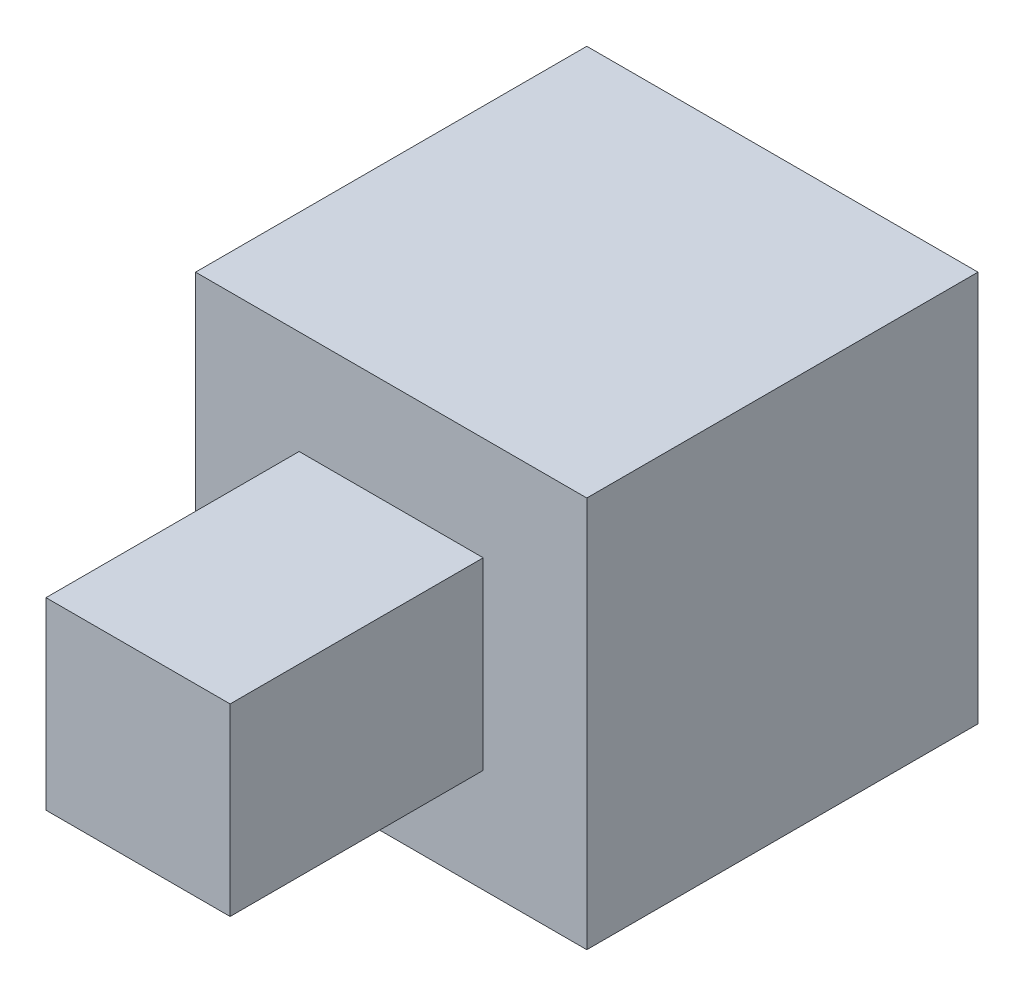
ISO-10303-21;
HEADER;
FILE_DESCRIPTION(('STEP AP214'),'2;1');
FILE_NAME('part.step','',(''),(''),'','','');
FILE_SCHEMA(('AUTOMOTIVE_DESIGN { 1 0 10303 214 1 1 1 1 }'));
ENDSEC;
DATA;
#1=APPLICATION_CONTEXT('core data for automotive mechanical design processes');
#2=APPLICATION_PROTOCOL_DEFINITION('international standard','automotive_design',2000,#1);
#3=PRODUCT_CONTEXT('',#1,'mechanical');
#4=PRODUCT('Part','Part','',(#3));
#5=PRODUCT_RELATED_PRODUCT_CATEGORY('part','',(#4));
#6=PRODUCT_DEFINITION_FORMATION('','',#4);
#7=PRODUCT_DEFINITION_CONTEXT('part definition',#1,'design');
#8=PRODUCT_DEFINITION('design','',#6,#7);
#9=PRODUCT_DEFINITION_SHAPE('','',#8);
#10=(LENGTH_UNIT() NAMED_UNIT(*) SI_UNIT(.MILLI.,.METRE.));
#11=(NAMED_UNIT(*) PLANE_ANGLE_UNIT() SI_UNIT($,.RADIAN.));
#12=(NAMED_UNIT(*) SI_UNIT($,.STERADIAN.) SOLID_ANGLE_UNIT());
#13=UNCERTAINTY_MEASURE_WITH_UNIT(LENGTH_MEASURE(1.E-05),#10,'distance_accuracy_value','');
#14=(GEOMETRIC_REPRESENTATION_CONTEXT(3) GLOBAL_UNCERTAINTY_ASSIGNED_CONTEXT((#13)) GLOBAL_UNIT_ASSIGNED_CONTEXT((#10,
#11,#12)) REPRESENTATION_CONTEXT('',''));
#15=CARTESIAN_POINT('',(0.,0.,0.));
#16=DIRECTION('',(0.,0.,1.));
#17=DIRECTION('',(1.,0.,0.));
#18=AXIS2_PLACEMENT_3D('',#15,#16,#17);
#19=CARTESIAN_POINT('',(4.25,4.25,8.5));
#20=DIRECTION('',(-1.,0.,0.));
#21=DIRECTION('',(0.,-1.,0.));
#22=AXIS2_PLACEMENT_3D('',#19,#20,#21);
#23=PLANE('',#22);
#24=DIRECTION('',(0.,1.,0.));
#25=VECTOR('',#24,1.);
#26=CARTESIAN_POINT('',(4.25,4.25,0.));
#27=LINE('',#26,#25);
#28=CARTESIAN_POINT('',(4.25,-4.25,0.));
#29=VERTEX_POINT('',#28);
#30=CARTESIAN_POINT('',(4.25,4.25,0.));
#31=VERTEX_POINT('',#30);
#32=EDGE_CURVE('E127',#29,#31,#27,.T.);
#33=ORIENTED_EDGE('',*,*,#32,.T.);
#34=DIRECTION('',(0.,0.,-1.));
#35=VECTOR('',#34,1.);
#36=CARTESIAN_POINT('',(4.25,4.25,8.5));
#37=LINE('',#36,#35);
#38=CARTESIAN_POINT('',(4.25,4.25,8.5));
#39=VERTEX_POINT('',#38);
#40=EDGE_CURVE('E11',#39,#31,#37,.T.);
#41=ORIENTED_EDGE('',*,*,#40,.F.);
#42=DIRECTION('',(0.,1.,0.));
#43=VECTOR('',#42,1.);
#44=CARTESIAN_POINT('',(4.25,4.25,8.5));
#45=LINE('',#44,#43);
#46=CARTESIAN_POINT('',(4.25,-4.25,8.5));
#47=VERTEX_POINT('',#46);
#48=EDGE_CURVE('E138',#47,#39,#45,.T.);
#49=ORIENTED_EDGE('',*,*,#48,.F.);
#50=DIRECTION('',(0.,0.,-1.));
#51=VECTOR('',#50,1.);
#52=CARTESIAN_POINT('',(4.25,-4.25,8.5));
#53=LINE('',#52,#51);
#54=EDGE_CURVE('E151',#47,#29,#53,.T.);
#55=ORIENTED_EDGE('',*,*,#54,.T.);
#56=EDGE_LOOP('',(#33,#41,#49,#55));
#57=FACE_BOUND('',#56,.T.);
#58=ADVANCED_FACE('F39',(#57),#23,.F.);
#59=CARTESIAN_POINT('',(-4.25,4.25,8.5));
#60=DIRECTION('',(0.,-1.,0.));
#61=DIRECTION('',(1.,0.,0.));
#62=AXIS2_PLACEMENT_3D('',#59,#60,#61);
#63=PLANE('',#62);
#64=DIRECTION('',(-1.,0.,0.));
#65=VECTOR('',#64,1.);
#66=CARTESIAN_POINT('',(-4.25,4.25,0.));
#67=LINE('',#66,#65);
#68=CARTESIAN_POINT('',(-4.25,4.25,0.));
#69=VERTEX_POINT('',#68);
#70=EDGE_CURVE('E132',#31,#69,#67,.T.);
#71=ORIENTED_EDGE('',*,*,#70,.T.);
#72=DIRECTION('',(0.,0.,-1.));
#73=VECTOR('',#72,1.);
#74=CARTESIAN_POINT('',(-4.25,4.25,8.5));
#75=LINE('',#74,#73);
#76=CARTESIAN_POINT('',(-4.25,4.25,8.5));
#77=VERTEX_POINT('',#76);
#78=EDGE_CURVE('E47',#77,#69,#75,.T.);
#79=ORIENTED_EDGE('',*,*,#78,.F.);
#80=DIRECTION('',(-1.,0.,0.));
#81=VECTOR('',#80,1.);
#82=CARTESIAN_POINT('',(-4.25,4.25,8.5));
#83=LINE('',#82,#81);
#84=EDGE_CURVE('E142',#39,#77,#83,.T.);
#85=ORIENTED_EDGE('',*,*,#84,.F.);
#86=ORIENTED_EDGE('',*,*,#40,.T.);
#87=EDGE_LOOP('',(#71,#79,#85,#86));
#88=FACE_BOUND('',#87,.T.);
#89=ADVANCED_FACE('F188',(#88),#63,.F.);
#90=CARTESIAN_POINT('',(-4.25,4.25,8.5));
#91=DIRECTION('',(1.,0.,0.));
#92=DIRECTION('',(0.,1.,0.));
#93=AXIS2_PLACEMENT_3D('',#90,#91,#92);
#94=PLANE('',#93);
#95=DIRECTION('',(0.,-1.,0.));
#96=VECTOR('',#95,1.);
#97=CARTESIAN_POINT('',(-4.25,4.25,0.));
#98=LINE('',#97,#96);
#99=CARTESIAN_POINT('',(-4.25,-4.25,0.));
#100=VERTEX_POINT('',#99);
#101=EDGE_CURVE('E155',#69,#100,#98,.T.);
#102=ORIENTED_EDGE('',*,*,#101,.T.);
#103=DIRECTION('',(0.,0.,-1.));
#104=VECTOR('',#103,1.);
#105=CARTESIAN_POINT('',(-4.25,-4.25,8.5));
#106=LINE('',#105,#104);
#107=CARTESIAN_POINT('',(-4.25,-4.25,8.5));
#108=VERTEX_POINT('',#107);
#109=EDGE_CURVE('E163',#108,#100,#106,.T.);
#110=ORIENTED_EDGE('',*,*,#109,.F.);
#111=DIRECTION('',(0.,-1.,0.));
#112=VECTOR('',#111,1.);
#113=CARTESIAN_POINT('',(-4.25,4.25,8.5));
#114=LINE('',#113,#112);
#115=EDGE_CURVE('E146',#77,#108,#114,.T.);
#116=ORIENTED_EDGE('',*,*,#115,.F.);
#117=ORIENTED_EDGE('',*,*,#78,.T.);
#118=EDGE_LOOP('',(#102,#110,#116,#117));
#119=FACE_BOUND('',#118,.T.);
#120=ADVANCED_FACE('F172',(#119),#94,.F.);
#121=CARTESIAN_POINT('',(-4.25,-4.25,8.5));
#122=DIRECTION('',(0.,1.,0.));
#123=DIRECTION('',(0.,0.,1.));
#124=AXIS2_PLACEMENT_3D('',#121,#122,#123);
#125=PLANE('',#124);
#126=DIRECTION('',(1.,0.,0.));
#127=VECTOR('',#126,1.);
#128=CARTESIAN_POINT('',(-4.25,-4.25,0.));
#129=LINE('',#128,#127);
#130=EDGE_CURVE('E143',#100,#29,#129,.T.);
#131=ORIENTED_EDGE('',*,*,#130,.T.);
#132=ORIENTED_EDGE('',*,*,#54,.F.);
#133=DIRECTION('',(1.,0.,0.));
#134=VECTOR('',#133,1.);
#135=CARTESIAN_POINT('',(-4.25,-4.25,8.5));
#136=LINE('',#135,#134);
#137=EDGE_CURVE('E149',#108,#47,#136,.T.);
#138=ORIENTED_EDGE('',*,*,#137,.F.);
#139=ORIENTED_EDGE('',*,*,#109,.T.);
#140=EDGE_LOOP('',(#131,#132,#138,#139));
#141=FACE_BOUND('',#140,.T.);
#142=ADVANCED_FACE('F181',(#141),#125,.F.);
#143=CARTESIAN_POINT('',(0.,0.,8.5));
#144=DIRECTION('',(0.,0.,1.));
#145=DIRECTION('',(1.,0.,0.));
#146=AXIS2_PLACEMENT_3D('',#143,#144,#145);
#147=PLANE('',#146);
#148=DIRECTION('',(0.,1.,0.));
#149=VECTOR('',#148,1.);
#150=CARTESIAN_POINT('',(2.,2.,8.5));
#151=LINE('',#150,#149);
#152=CARTESIAN_POINT('',(2.,-2.,8.5));
#153=VERTEX_POINT('',#152);
#154=CARTESIAN_POINT('',(2.,2.,8.5));
#155=VERTEX_POINT('',#154);
#156=EDGE_CURVE('E54',#153,#155,#151,.T.);
#157=ORIENTED_EDGE('',*,*,#156,.F.);
#158=DIRECTION('',(1.,0.,0.));
#159=VECTOR('',#158,1.);
#160=CARTESIAN_POINT('',(-2.,-2.,8.5));
#161=LINE('',#160,#159);
#162=CARTESIAN_POINT('',(-2.,-2.,8.5));
#163=VERTEX_POINT('',#162);
#164=EDGE_CURVE('E58',#163,#153,#161,.T.);
#165=ORIENTED_EDGE('',*,*,#164,.F.);
#166=DIRECTION('',(0.,-1.,0.));
#167=VECTOR('',#166,1.);
#168=CARTESIAN_POINT('',(-2.,2.,8.5));
#169=LINE('',#168,#167);
#170=CARTESIAN_POINT('',(-2.,2.,8.5));
#171=VERTEX_POINT('',#170);
#172=EDGE_CURVE('E283',#171,#163,#169,.T.);
#173=ORIENTED_EDGE('',*,*,#172,.F.);
#174=DIRECTION('',(-1.,0.,0.));
#175=VECTOR('',#174,1.);
#176=CARTESIAN_POINT('',(-2.,2.,8.5));
#177=LINE('',#176,#175);
#178=EDGE_CURVE('E293',#155,#171,#177,.T.);
#179=ORIENTED_EDGE('',*,*,#178,.F.);
#180=EDGE_LOOP('',(#157,#165,#173,#179));
#181=FACE_BOUND('',#180,.T.);
#182=ORIENTED_EDGE('',*,*,#48,.T.);
#183=ORIENTED_EDGE('',*,*,#84,.T.);
#184=ORIENTED_EDGE('',*,*,#115,.T.);
#185=ORIENTED_EDGE('',*,*,#137,.T.);
#186=EDGE_LOOP('',(#182,#183,#184,#185));
#187=FACE_BOUND('',#186,.T.);
#188=ADVANCED_FACE('F187',(#181,#187),#147,.T.);
#189=CARTESIAN_POINT('',(0.,0.,0.));
#190=DIRECTION('',(0.,0.,1.));
#191=DIRECTION('',(1.,0.,0.));
#192=AXIS2_PLACEMENT_3D('',#189,#190,#191);
#193=PLANE('',#192);
#194=ORIENTED_EDGE('',*,*,#32,.F.);
#195=ORIENTED_EDGE('',*,*,#130,.F.);
#196=ORIENTED_EDGE('',*,*,#101,.F.);
#197=ORIENTED_EDGE('',*,*,#70,.F.);
#198=EDGE_LOOP('',(#194,#195,#196,#197));
#199=FACE_BOUND('',#198,.T.);
#200=ADVANCED_FACE('F178',(#199),#193,.F.);
#201=CARTESIAN_POINT('',(2.,2.,14.));
#202=DIRECTION('',(-1.,0.,0.));
#203=DIRECTION('',(0.,-1.,0.));
#204=AXIS2_PLACEMENT_3D('',#201,#202,#203);
#205=PLANE('',#204);
#206=ORIENTED_EDGE('',*,*,#156,.T.);
#207=DIRECTION('',(0.,0.,-1.));
#208=VECTOR('',#207,1.);
#209=CARTESIAN_POINT('',(2.,2.,14.));
#210=LINE('',#209,#208);
#211=CARTESIAN_POINT('',(2.,2.,14.));
#212=VERTEX_POINT('',#211);
#213=EDGE_CURVE('E107',#212,#155,#210,.T.);
#214=ORIENTED_EDGE('',*,*,#213,.F.);
#215=DIRECTION('',(0.,1.,0.));
#216=VECTOR('',#215,1.);
#217=CARTESIAN_POINT('',(2.,2.,14.));
#218=LINE('',#217,#216);
#219=CARTESIAN_POINT('',(2.,-2.,14.));
#220=VERTEX_POINT('',#219);
#221=EDGE_CURVE('E114',#220,#212,#218,.T.);
#222=ORIENTED_EDGE('',*,*,#221,.F.);
#223=DIRECTION('',(0.,0.,-1.));
#224=VECTOR('',#223,1.);
#225=CARTESIAN_POINT('',(2.,-2.,14.));
#226=LINE('',#225,#224);
#227=EDGE_CURVE('E280',#220,#153,#226,.T.);
#228=ORIENTED_EDGE('',*,*,#227,.T.);
#229=EDGE_LOOP('',(#206,#214,#222,#228));
#230=FACE_BOUND('',#229,.T.);
#231=ADVANCED_FACE('F125',(#230),#205,.F.);
#232=CARTESIAN_POINT('',(-2.,2.,14.));
#233=DIRECTION('',(0.,-1.,0.));
#234=DIRECTION('',(0.,0.,-1.));
#235=AXIS2_PLACEMENT_3D('',#232,#233,#234);
#236=PLANE('',#235);
#237=ORIENTED_EDGE('',*,*,#178,.T.);
#238=DIRECTION('',(0.,0.,-1.));
#239=VECTOR('',#238,1.);
#240=CARTESIAN_POINT('',(-2.,2.,14.));
#241=LINE('',#240,#239);
#242=CARTESIAN_POINT('',(-2.,2.,14.));
#243=VERTEX_POINT('',#242);
#244=EDGE_CURVE('E109',#243,#171,#241,.T.);
#245=ORIENTED_EDGE('',*,*,#244,.F.);
#246=DIRECTION('',(-1.,0.,0.));
#247=VECTOR('',#246,1.);
#248=CARTESIAN_POINT('',(-2.,2.,14.));
#249=LINE('',#248,#247);
#250=EDGE_CURVE('E102',#212,#243,#249,.T.);
#251=ORIENTED_EDGE('',*,*,#250,.F.);
#252=ORIENTED_EDGE('',*,*,#213,.T.);
#253=EDGE_LOOP('',(#237,#245,#251,#252));
#254=FACE_BOUND('',#253,.T.);
#255=ADVANCED_FACE('F105',(#254),#236,.F.);
#256=CARTESIAN_POINT('',(-2.,2.,14.));
#257=DIRECTION('',(1.,0.,0.));
#258=DIRECTION('',(0.,1.,0.));
#259=AXIS2_PLACEMENT_3D('',#256,#257,#258);
#260=PLANE('',#259);
#261=ORIENTED_EDGE('',*,*,#172,.T.);
#262=DIRECTION('',(0.,0.,-1.));
#263=VECTOR('',#262,1.);
#264=CARTESIAN_POINT('',(-2.,-2.,14.));
#265=LINE('',#264,#263);
#266=CARTESIAN_POINT('',(-2.,-2.,14.));
#267=VERTEX_POINT('',#266);
#268=EDGE_CURVE('E134',#267,#163,#265,.T.);
#269=ORIENTED_EDGE('',*,*,#268,.F.);
#270=DIRECTION('',(0.,-1.,0.));
#271=VECTOR('',#270,1.);
#272=CARTESIAN_POINT('',(-2.,2.,14.));
#273=LINE('',#272,#271);
#274=EDGE_CURVE('E113',#243,#267,#273,.T.);
#275=ORIENTED_EDGE('',*,*,#274,.F.);
#276=ORIENTED_EDGE('',*,*,#244,.T.);
#277=EDGE_LOOP('',(#261,#269,#275,#276));
#278=FACE_BOUND('',#277,.T.);
#279=ADVANCED_FACE('F206',(#278),#260,.F.);
#280=CARTESIAN_POINT('',(-2.,-2.,14.));
#281=DIRECTION('',(0.,1.,0.));
#282=DIRECTION('',(0.,0.,1.));
#283=AXIS2_PLACEMENT_3D('',#280,#281,#282);
#284=PLANE('',#283);
#285=ORIENTED_EDGE('',*,*,#164,.T.);
#286=ORIENTED_EDGE('',*,*,#227,.F.);
#287=DIRECTION('',(1.,0.,0.));
#288=VECTOR('',#287,1.);
#289=CARTESIAN_POINT('',(-2.,-2.,14.));
#290=LINE('',#289,#288);
#291=EDGE_CURVE('E119',#267,#220,#290,.T.);
#292=ORIENTED_EDGE('',*,*,#291,.F.);
#293=ORIENTED_EDGE('',*,*,#268,.T.);
#294=EDGE_LOOP('',(#285,#286,#292,#293));
#295=FACE_BOUND('',#294,.T.);
#296=ADVANCED_FACE('F209',(#295),#284,.F.);
#297=CARTESIAN_POINT('',(0.,0.,14.));
#298=DIRECTION('',(0.,0.,1.));
#299=DIRECTION('',(1.,0.,0.));
#300=AXIS2_PLACEMENT_3D('',#297,#298,#299);
#301=PLANE('',#300);
#302=ORIENTED_EDGE('',*,*,#221,.T.);
#303=ORIENTED_EDGE('',*,*,#250,.T.);
#304=ORIENTED_EDGE('',*,*,#274,.T.);
#305=ORIENTED_EDGE('',*,*,#291,.T.);
#306=EDGE_LOOP('',(#302,#303,#304,#305));
#307=FACE_BOUND('',#306,.T.);
#308=ADVANCED_FACE('F117',(#307),#301,.T.);
#309=CLOSED_SHELL('',(#58,#89,#120,#142,#188,#200,#231,#255,#279,#296,#308));
#310=MANIFOLD_SOLID_BREP('B2',#309);
#311=ADVANCED_BREP_SHAPE_REPRESENTATION('',(#18,#310),#14);
#312=SHAPE_DEFINITION_REPRESENTATION(#9,#311);
ENDSEC;
END-ISO-10303-21;
